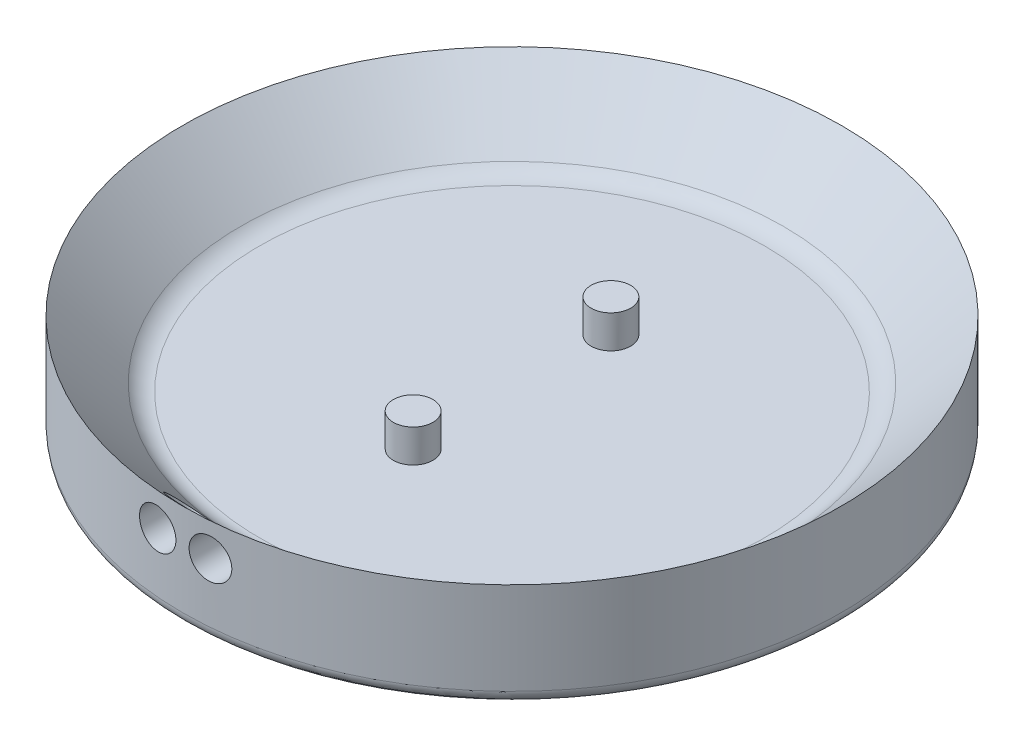
ISO-10303-21;
HEADER;
FILE_DESCRIPTION(('STEP AP214'),'2;1');
FILE_NAME('part.step','',(''),(''),'','','');
FILE_SCHEMA(('AUTOMOTIVE_DESIGN { 1 0 10303 214 1 1 1 1 }'));
ENDSEC;
DATA;
#1=APPLICATION_CONTEXT('core data for automotive mechanical design processes');
#2=APPLICATION_PROTOCOL_DEFINITION('international standard','automotive_design',2000,#1);
#3=PRODUCT_CONTEXT('',#1,'mechanical');
#4=PRODUCT('Part','Part','',(#3));
#5=PRODUCT_RELATED_PRODUCT_CATEGORY('part','',(#4));
#6=PRODUCT_DEFINITION_FORMATION('','',#4);
#7=PRODUCT_DEFINITION_CONTEXT('part definition',#1,'design');
#8=PRODUCT_DEFINITION('design','',#6,#7);
#9=PRODUCT_DEFINITION_SHAPE('','',#8);
#10=(LENGTH_UNIT() NAMED_UNIT(*) SI_UNIT(.MILLI.,.METRE.));
#11=(NAMED_UNIT(*) PLANE_ANGLE_UNIT() SI_UNIT($,.RADIAN.));
#12=(NAMED_UNIT(*) SI_UNIT($,.STERADIAN.) SOLID_ANGLE_UNIT());
#13=UNCERTAINTY_MEASURE_WITH_UNIT(LENGTH_MEASURE(1.E-05),#10,'distance_accuracy_value','');
#14=(GEOMETRIC_REPRESENTATION_CONTEXT(3) GLOBAL_UNCERTAINTY_ASSIGNED_CONTEXT((#13)) GLOBAL_UNIT_ASSIGNED_CONTEXT((#10,
#11,#12)) REPRESENTATION_CONTEXT('',''));
#15=CARTESIAN_POINT('',(0.,0.,0.));
#16=DIRECTION('',(0.,0.,1.));
#17=DIRECTION('',(1.,0.,0.));
#18=AXIS2_PLACEMENT_3D('',#15,#16,#17);
#19=CARTESIAN_POINT('',(0.,1.,0.));
#20=DIRECTION('',(0.,-1.,0.));
#21=DIRECTION('',(0.,0.,-1.));
#22=AXIS2_PLACEMENT_3D('',#19,#20,#21);
#23=TOROIDAL_SURFACE('',#22,24.,1.);
#24=CARTESIAN_POINT('',(0.,0.,0.));
#25=DIRECTION('',(0.,-1.,0.));
#26=DIRECTION('',(0.,0.,-1.));
#27=AXIS2_PLACEMENT_3D('',#24,#25,#26);
#28=CIRCLE('',#27,24.);
#29=CARTESIAN_POINT('',(0.,0.,-24.));
#30=VERTEX_POINT('',#29);
#31=EDGE_CURVE('E55',#30,#30,#28,.T.);
#32=ORIENTED_EDGE('',*,*,#31,.F.);
#33=EDGE_LOOP('',(#32));
#34=FACE_BOUND('',#33,.T.);
#35=CARTESIAN_POINT('',(0.,1.,0.));
#36=DIRECTION('',(0.,-1.,0.));
#37=DIRECTION('',(0.,0.,-1.));
#38=AXIS2_PLACEMENT_3D('',#35,#36,#37);
#39=CIRCLE('',#38,25.);
#40=CARTESIAN_POINT('',(0.,1.,-25.));
#41=VERTEX_POINT('',#40);
#42=EDGE_CURVE('E74',#41,#41,#39,.T.);
#43=ORIENTED_EDGE('',*,*,#42,.T.);
#44=EDGE_LOOP('',(#43));
#45=FACE_BOUND('',#44,.T.);
#46=ADVANCED_FACE('F43',(#34,#45),#23,.T.);
#47=CARTESIAN_POINT('',(-23.,0.,0.));
#48=DIRECTION('',(0.,1.,0.));
#49=DIRECTION('',(0.,0.,1.));
#50=AXIS2_PLACEMENT_3D('',#47,#48,#49);
#51=PLANE('',#50);
#52=ORIENTED_EDGE('',*,*,#31,.T.);
#53=EDGE_LOOP('',(#52));
#54=FACE_BOUND('',#53,.T.);
#55=ADVANCED_FACE('F139',(#54),#51,.F.);
#56=CARTESIAN_POINT('',(-19.1715728752538,3.,0.));
#57=DIRECTION('',(0.,-1.,0.));
#58=DIRECTION('',(0.,0.,-1.));
#59=AXIS2_PLACEMENT_3D('',#56,#57,#58);
#60=PLANE('',#59);
#61=CARTESIAN_POINT('',(0.,3.,7.5));
#62=DIRECTION('',(0.,-1.,0.));
#63=DIRECTION('',(0.,0.,-1.));
#64=AXIS2_PLACEMENT_3D('',#61,#62,#63);
#65=CIRCLE('',#64,1.5);
#66=CARTESIAN_POINT('',(0.,3.,6.));
#67=VERTEX_POINT('',#66);
#68=EDGE_CURVE('E10',#67,#67,#65,.F.);
#69=ORIENTED_EDGE('',*,*,#68,.F.);
#70=EDGE_LOOP('',(#69));
#71=FACE_BOUND('',#70,.T.);
#72=CARTESIAN_POINT('',(0.,3.,-7.5));
#73=DIRECTION('',(0.,-1.,0.));
#74=DIRECTION('',(0.,0.,-1.));
#75=AXIS2_PLACEMENT_3D('',#72,#73,#74);
#76=CIRCLE('',#75,1.5);
#77=CARTESIAN_POINT('',(0.,3.,-9.));
#78=VERTEX_POINT('',#77);
#79=EDGE_CURVE('E50',#78,#78,#76,.F.);
#80=ORIENTED_EDGE('',*,*,#79,.F.);
#81=EDGE_LOOP('',(#80));
#82=FACE_BOUND('',#81,.T.);
#83=CARTESIAN_POINT('',(0.,3.,0.));
#84=DIRECTION('',(0.,-1.,0.));
#85=DIRECTION('',(0.,0.,-1.));
#86=AXIS2_PLACEMENT_3D('',#83,#84,#85);
#87=CIRCLE('',#86,19.1715728752538);
#88=CARTESIAN_POINT('',(0.,3.,-19.1715728752538));
#89=VERTEX_POINT('',#88);
#90=EDGE_CURVE('E60',#89,#89,#87,.T.);
#91=ORIENTED_EDGE('',*,*,#90,.F.);
#92=EDGE_LOOP('',(#91));
#93=FACE_BOUND('',#92,.T.);
#94=ADVANCED_FACE('F144',(#71,#82,#93),#60,.F.);
#95=CARTESIAN_POINT('',(0.,5.,0.));
#96=DIRECTION('',(0.,-1.,0.));
#97=DIRECTION('',(0.,0.,-1.));
#98=AXIS2_PLACEMENT_3D('',#95,#96,#97);
#99=TOROIDAL_SURFACE('',#98,19.1715728752538,2.);
#100=CARTESIAN_POINT('',(0.,3.5857864376269,0.));
#101=DIRECTION('',(0.,-1.,0.));
#102=DIRECTION('',(0.,0.,-1.));
#103=AXIS2_PLACEMENT_3D('',#100,#101,#102);
#104=CIRCLE('',#103,20.5857864376269);
#105=CARTESIAN_POINT('',(0.,3.5857864376269,-20.5857864376269));
#106=VERTEX_POINT('',#105);
#107=EDGE_CURVE('E66',#106,#106,#104,.T.);
#108=ORIENTED_EDGE('',*,*,#107,.F.);
#109=EDGE_LOOP('',(#108));
#110=FACE_BOUND('',#109,.T.);
#111=ORIENTED_EDGE('',*,*,#90,.T.);
#112=EDGE_LOOP('',(#111));
#113=FACE_BOUND('',#112,.T.);
#114=ADVANCED_FACE('F160',(#110,#113),#99,.F.);
#115=CARTESIAN_POINT('',(0.,3.5857864376269,0.));
#116=DIRECTION('',(0.,1.,0.));
#117=DIRECTION('',(0.,0.,1.));
#118=AXIS2_PLACEMENT_3D('',#115,#116,#117);
#119=CONICAL_SURFACE('',#118,20.5857864376269,0.785398163397449);
#120=CARTESIAN_POINT('',(-2.65139076383462,4.14881899676564,20.9819606468927));
#121=CARTESIAN_POINT('',(-2.72542497420691,4.18451854351562,21.0085885687962));
#122=CARTESIAN_POINT('',(-2.795010754431,4.2256118638844,21.0408635599312));
#123=CARTESIAN_POINT('',(-2.92387568672394,4.3156425319557,21.1142389047565));
#124=CARTESIAN_POINT('',(-2.98310284785251,4.36461720527135,21.1553815866178));
#125=CARTESIAN_POINT('',(-3.1041036642441,4.4804133348628,21.2550262957546));
#126=CARTESIAN_POINT('',(-3.1630059834274,4.54868127865626,21.3153179274971));
#127=CARTESIAN_POINT('',(-3.26546682185978,4.68992158945896,21.4427399721577));
#128=CARTESIAN_POINT('',(-3.30901650710475,4.76289663649251,21.5098742938587));
#129=CARTESIAN_POINT('',(-3.39547583001479,4.93839966650395,21.674071738518));
#130=CARTESIAN_POINT('',(-3.43237734284057,5.04201237972336,21.7731309931857));
#131=CARTESIAN_POINT('',(-3.48294193308828,5.25023515358621,21.975943863211));
#132=CARTESIAN_POINT('',(-3.49657553050927,5.35484631083701,22.0797032630514));
#133=CARTESIAN_POINT('',(-3.50235454916626,5.56500544683655,22.2915493643565));
#134=CARTESIAN_POINT('',(-3.49400486352244,5.67052073459008,22.3996808241649));
#135=CARTESIAN_POINT('',(-3.45543316600535,5.87794559084736,22.6155176739394));
#136=CARTESIAN_POINT('',(-3.42521340454889,5.97985552920764,22.7232231065969));
#137=CARTESIAN_POINT('',(-3.34628715193839,6.16857039150218,22.9256982733362));
#138=CARTESIAN_POINT('',(-3.29954883072927,6.25590062777606,23.0207431269384));
#139=CARTESIAN_POINT('',(-3.18651029948879,6.42323904244126,23.2055818109311));
#140=CARTESIAN_POINT('',(-3.12023999429772,6.50325817107691,23.2953834190955));
#141=CARTESIAN_POINT('',(-2.99112846067283,6.62824595043113,23.438230401792));
#142=CARTESIAN_POINT('',(-2.93401534511861,6.67622043335249,23.4938211259571));
#143=CARTESIAN_POINT('',(-2.80940011152838,6.76519362164917,23.5986511649394));
#144=CARTESIAN_POINT('',(-2.7419134015665,6.80620248605226,23.6478997037196));
#145=CARTESIAN_POINT('',(-2.61335744630595,6.87028700028482,23.7268725603604));
#146=CARTESIAN_POINT('',(-2.55442748969971,6.895316081192,23.7584763127986));
#147=CARTESIAN_POINT('',(-2.43085779369609,6.93827050660399,23.8146141538313));
#148=CARTESIAN_POINT('',(-2.36622551496041,6.95620496964712,23.8391573060959));
#149=CARTESIAN_POINT('',(-2.24291591685094,6.98132104172112,23.8762734097205));
#150=CARTESIAN_POINT('',(-2.18487674034516,6.98974154026574,23.8901146703932));
#151=CARTESIAN_POINT('',(-2.0669541170097,6.999669978482,23.9105710180682));
#152=CARTESIAN_POINT('',(-2.00707179066792,7.00118203752355,23.9171904095394));
#153=CARTESIAN_POINT('',(-1.88706376580968,6.99694950309519,23.9227128060676));
#154=CARTESIAN_POINT('',(-1.82693782277221,6.99118859915452,23.921598442035));
#155=CARTESIAN_POINT('',(-1.70843222173764,6.97261284600017,23.9117310231657));
#156=CARTESIAN_POINT('',(-1.65005303318683,6.95979611814768,23.9029759335945));
#157=CARTESIAN_POINT('',(-1.53819754349364,6.92829413652778,23.8788642201954));
#158=CARTESIAN_POINT('',(-1.48462995883017,6.90978233520877,23.8636983184244));
#159=CARTESIAN_POINT('',(-1.38154994573573,6.86770789809791,23.8277431124235));
#160=CARTESIAN_POINT('',(-1.33203925933376,6.84414310810278,23.8069514087941));
#161=CARTESIAN_POINT('',(-1.21564550255684,6.78100418547552,23.7500082939016));
#162=CARTESIAN_POINT('',(-1.15133732692582,6.73907025796645,23.7112030848918));
#163=CARTESIAN_POINT('',(-1.0326889338324,6.64886598246533,23.6263774453465));
#164=CARTESIAN_POINT('',(-0.978372125377375,6.60058119724882,23.5803405273918));
#165=CARTESIAN_POINT('',(-0.859168123829121,6.47898572433059,23.4633568383397));
#166=CARTESIAN_POINT('',(-0.798983366404516,6.40349081681298,23.3899003630913));
#167=CARTESIAN_POINT('',(-0.695979624822928,6.24720286558757,23.2368334557322));
#168=CARTESIAN_POINT('',(-0.653187998282636,6.16640170574997,23.15721356153));
#169=CARTESIAN_POINT('',(-0.5723493623997,5.97517023225837,22.9680815972252));
#170=CARTESIAN_POINT('',(-0.54026180118186,5.86357356439974,22.8571961639108));
#171=CARTESIAN_POINT('',(-0.502044554629696,5.63847057957151,22.6329084623078));
#172=CARTESIAN_POINT('',(-0.495942424461634,5.52496236352188,22.5195036504349));
#173=CARTESIAN_POINT('',(-0.509301812300093,5.29772584660527,22.2919107731094));
#174=CARTESIAN_POINT('',(-0.52904359312356,5.18400871129824,22.1777277027191));
#175=CARTESIAN_POINT('',(-0.595377998185321,4.96097733193852,21.9529358869296));
#176=CARTESIAN_POINT('',(-0.641932135929493,4.85165701680285,21.842322257774));
#177=CARTESIAN_POINT('',(-0.746143237393624,4.67217592305761,21.6593749944488));
#178=CARTESIAN_POINT('',(-0.796750384091204,4.59979890061895,21.5851853035795));
#179=CARTESIAN_POINT('',(-0.913403375668737,4.46200496702152,21.4426466942976));
#180=CARTESIAN_POINT('',(-0.979426127610195,4.39657785596412,21.3742892461607));
#181=CARTESIAN_POINT('',(-1.10947183507139,4.29079795033036,21.2619503195847));
#182=CARTESIAN_POINT('',(-1.17005484585948,4.24822164833409,21.2160899911693));
#183=CARTESIAN_POINT('',(-1.30037663062701,4.17099936504538,21.1311328191529));
#184=CARTESIAN_POINT('',(-1.37010329507893,4.13634305843538,21.0920271858778));
#185=CARTESIAN_POINT('',(-1.50348233147243,4.08311178354928,21.0295242503765));
#186=CARTESIAN_POINT('',(-1.56566395864126,4.06271829105543,21.004550732782));
#187=CARTESIAN_POINT('',(-1.69445410498186,4.02995050430874,20.9616785062909));
#188=CARTESIAN_POINT('',(-1.76105964777954,4.01757087745955,20.9437750958947));
#189=CARTESIAN_POINT('',(-1.8974931014685,4.00192347481265,20.9161448453975));
#190=CARTESIAN_POINT('',(-1.96733915538864,3.99871549521256,20.9064719512541));
#191=CARTESIAN_POINT('',(-2.10748397630747,4.00221773316829,20.8963294919699));
#192=CARTESIAN_POINT('',(-2.17778271049296,4.00892723972147,20.8958592671074));
#193=CARTESIAN_POINT('',(-2.30854133462527,4.03074420729508,20.9037450795463));
#194=CARTESIAN_POINT('',(-2.36923384461343,4.04484839958804,20.9111374120204));
#195=CARTESIAN_POINT('',(-2.4871819564979,4.07999038563828,20.9328259311467));
#196=CARTESIAN_POINT('',(-2.54444350301035,4.10101575122155,20.9471097641613));
#197=CARTESIAN_POINT('',(-2.61694967428602,4.13261366386245,20.9699599100324));
#198=CARTESIAN_POINT('',(-2.63428890479631,4.14057242247007,20.9758096125994));
#199=CARTESIAN_POINT('',(-2.65139076383462,4.14881899676564,20.9819606468927));
#200=B_SPLINE_CURVE_WITH_KNOTS('',3,(#120,#121,#122,#123,#124,#125,#126,#127,#128,#129,#130,
#131,#132,#133,#134,#135,#136,#137,#138,#139,#140,#141,#142,#143,#144,#145,#146,#147,#148,#149,
#150,#151,#152,#153,#154,#155,#156,#157,#158,#159,#160,#161,#162,#163,#164,#165,#166,#167,#168,
#169,#170,#171,#172,#173,#174,#175,#176,#177,#178,#179,#180,#181,#182,#183,#184,#185,#186,#187,
#188,#189,#190,#191,#192,#193,#194,#195,#196,#197,#198,#199),.UNSPECIFIED.,.T.,.F.,(4,2,2,2,2,2,
2,2,2,2,2,2,2,2,2,2,2,2,2,2,2,2,2,2,2,2,2,2,2,2,2,2,2,2,2,2,2,2,2,4),(0.,0.25913619387103,
0.519537855761893,0.84314591310417,1.16693987383334,1.60864476439594,2.05090887223562,
2.50321837739902,2.95548134681997,3.36591788815848,3.77572925814245,4.05398816109445,
4.33183768542707,4.5452737315448,4.75843455525121,4.93842907275552,5.11831624896355,
5.29860756078031,5.47894689904856,5.65426178517794,5.82965156113246,6.08627606615025,
6.34349437047106,6.70545446166836,7.06798169622301,7.5471851638416,8.02689665644518,
8.5118536946582,8.99611635363359,9.34102868397663,9.68542760546999,9.945825511965,
10.2058819753943,10.4151797364727,10.6243380828258,10.8348569988605,11.0453608231423,
11.2327452874661,11.4197950892462,11.4796553975688),.UNSPECIFIED.);
#201=CARTESIAN_POINT('',(-2.65139076383462,4.14881899676564,20.9819606468927));
#202=VERTEX_POINT('',#201);
#203=EDGE_CURVE('E78',#202,#202,#200,.T.);
#204=ORIENTED_EDGE('',*,*,#203,.F.);
#205=EDGE_LOOP('',(#204));
#206=FACE_BOUND('',#205,.T.);
#207=CARTESIAN_POINT('',(1.83083952474417,4.00956894369071,20.9296443790698));
#208=CARTESIAN_POINT('',(1.75478447166187,4.01821151560841,20.9449717336368));
#209=CARTESIAN_POINT('',(1.68030471265768,4.03260319935538,20.9655023358055));
#210=CARTESIAN_POINT('',(1.53693329160857,4.07131599890465,21.0153193801841));
#211=CARTESIAN_POINT('',(1.46806514558209,4.09567655765545,21.0446404782971));
#212=CARTESIAN_POINT('',(1.33805242111261,4.15211607863738,21.1098573517964));
#213=CARTESIAN_POINT('',(1.27683396739197,4.18411082569127,21.1456804356152));
#214=CARTESIAN_POINT('',(1.16178857941135,4.25422946870829,21.2225369807901));
#215=CARTESIAN_POINT('',(1.10795755952691,4.29234995129685,21.2635675377838));
#216=CARTESIAN_POINT('',(0.980502601856421,4.39524247540064,21.3729156857272));
#217=CARTESIAN_POINT('',(0.911886102572185,4.46329099818877,21.4440044355915));
#218=CARTESIAN_POINT('',(0.791211701490972,4.60687988021262,21.5924809845191));
#219=CARTESIAN_POINT('',(0.739197039749021,4.68243914166078,21.6698845837271));
#220=CARTESIAN_POINT('',(0.637426958371377,4.86200692174613,21.8527981568405));
#221=CARTESIAN_POINT('',(0.593145596872006,4.96769130215599,21.9597101630197));
#222=CARTESIAN_POINT('',(0.529562278064357,5.18307960851339,22.1767837957356));
#223=CARTESIAN_POINT('',(0.510280666107908,5.29278673369962,22.2869479945092));
#224=CARTESIAN_POINT('',(0.495904147305461,5.5146705937769,22.5092105927747));
#225=CARTESIAN_POINT('',(0.501124502316265,5.62686092961655,22.6213156093865));
#226=CARTESIAN_POINT('',(0.53693680008075,5.84949939793727,22.8431955777946));
#227=CARTESIAN_POINT('',(0.567506857963238,5.9599489494872,22.9529724557072));
#228=CARTESIAN_POINT('',(0.644677062566,6.14862670892604,23.1396678620751));
#229=CARTESIAN_POINT('',(0.685325366104145,6.22798230441046,23.2179161185892));
#230=CARTESIAN_POINT('',(0.783158814774619,6.38180889582629,23.368736368504));
#231=CARTESIAN_POINT('',(0.840317461235424,6.45628748609085,23.4413172226647));
#232=CARTESIAN_POINT('',(0.953959868691422,6.57731433876918,23.5580509569139));
#233=CARTESIAN_POINT('',(1.00606638236709,6.62580624718613,23.6044398312792));
#234=CARTESIAN_POINT('',(1.12003739245321,6.71695131248337,23.6905533085665));
#235=CARTESIAN_POINT('',(1.18188737480821,6.75961298042755,23.7302876454131));
#236=CARTESIAN_POINT('',(1.3008171863864,6.82845412288274,23.7929751715542));
#237=CARTESIAN_POINT('',(1.35604496764476,6.85620361788638,23.8176992998926));
#238=CARTESIAN_POINT('',(1.47183370578265,6.90534153101549,23.8600554420406));
#239=CARTESIAN_POINT('',(1.53239082272879,6.92673448134817,23.8776925120892));
#240=CARTESIAN_POINT('',(1.65802870704445,6.96196412245185,23.9046125521321));
#241=CARTESIAN_POINT('',(1.72314106750469,6.97574058847549,23.9138293041948));
#242=CARTESIAN_POINT('',(1.85525566995216,6.99448679334146,23.9227444849299));
#243=CARTESIAN_POINT('',(1.92225678914359,6.99946165674271,23.9224484541573));
#244=CARTESIAN_POINT('',(2.04735872965701,7.00039513197041,23.9129826406482));
#245=CARTESIAN_POINT('',(2.10554226597398,6.99738579080729,23.904906871214));
#246=CARTESIAN_POINT('',(2.2198428108531,6.98491609740686,23.8820404934138));
#247=CARTESIAN_POINT('',(2.27595941042068,6.97545447557759,23.8672485637247));
#248=CARTESIAN_POINT('',(2.3871617370613,6.95034039423591,23.8311488987541));
#249=CARTESIAN_POINT('',(2.44211631062564,6.93445530986273,23.8096040708175));
#250=CARTESIAN_POINT('',(2.54782890893045,6.89750663688853,23.7613642858174));
#251=CARTESIAN_POINT('',(2.59858480462746,6.87644044232789,23.7346667385332));
#252=CARTESIAN_POINT('',(2.72439818015181,6.81627821506377,23.6600818996944));
#253=CARTESIAN_POINT('',(2.79601269091068,6.77389946988585,23.6090188748354));
#254=CARTESIAN_POINT('',(2.9278905967207,6.68133119072393,23.499747276734));
#255=CARTESIAN_POINT('',(2.98812124754414,6.63111986133827,23.4415188631288));
#256=CARTESIAN_POINT('',(3.12100278209786,6.50257250008621,23.2945942518659));
#257=CARTESIAN_POINT('',(3.18811256588472,6.42133063640609,23.2034376441819));
#258=CARTESIAN_POINT('',(3.30223357382283,6.25144433727767,23.0158584420833));
#259=CARTESIAN_POINT('',(3.34923154622554,6.16279506689252,22.9194324226675));
#260=CARTESIAN_POINT('',(3.42551869737541,5.97771793709672,22.7210068993069));
#261=CARTESIAN_POINT('',(3.45421592693989,5.88113437663324,22.6189272408515));
#262=CARTESIAN_POINT('',(3.49197113163186,5.68453498779798,22.4141795816378));
#263=CARTESIAN_POINT('',(3.50100573510056,5.58451521824959,22.3115110260031));
#264=CARTESIAN_POINT('',(3.49925810569949,5.42351074021961,22.1487943911915));
#265=CARTESIAN_POINT('',(3.49497600068819,5.36297708506791,22.0881848036241));
#266=CARTESIAN_POINT('',(3.47887947111869,5.24182216017343,21.9680685045676));
#267=CARTESIAN_POINT('',(3.46706235009211,5.18120086682022,21.908562195744));
#268=CARTESIAN_POINT('',(3.41975579986905,5.00017806622695,21.7327738093703));
#269=CARTESIAN_POINT('',(3.37241214866979,4.88015589768537,21.6187546051965));
#270=CARTESIAN_POINT('',(3.26995875417529,4.69816528427016,21.4503707656018));
#271=CARTESIAN_POINT('',(3.22696789896862,4.63344973276324,21.3914571370886));
#272=CARTESIAN_POINT('',(3.12833886212686,4.50845174607923,21.2797713323301));
#273=CARTESIAN_POINT('',(3.07272087411341,4.44816243389432,21.226989551439));
#274=CARTESIAN_POINT('',(2.96086098893554,4.34620016078028,21.1399019204203));
#275=CARTESIAN_POINT('',(2.90703617434735,4.30323215589472,21.1040203458825));
#276=CARTESIAN_POINT('',(2.7910532590327,4.22361351828358,21.0393584915353));
#277=CARTESIAN_POINT('',(2.72890542981381,4.18695522412708,21.0105695810158));
#278=CARTESIAN_POINT('',(2.60775658098806,4.12725379834823,20.9657621645949));
#279=CARTESIAN_POINT('',(2.54985530955087,4.1029693369385,20.9484348081833));
#280=CARTESIAN_POINT('',(2.42989605372543,4.06152589877838,20.9209661290993));
#281=CARTESIAN_POINT('',(2.36783855794505,4.04436608615223,20.9108239633496));
#282=CARTESIAN_POINT('',(2.24101438099137,4.01806720286488,20.898346906456));
#283=CARTESIAN_POINT('',(2.17623782360742,4.00896060919519,20.8960435222022));
#284=CARTESIAN_POINT('',(2.04635056964915,3.99930837723227,20.8994635398115));
#285=CARTESIAN_POINT('',(1.98124074245016,3.9987464961921,20.9051716898741));
#286=CARTESIAN_POINT('',(1.88809426809609,4.00389616678198,20.9188819786031));
#287=CARTESIAN_POINT('',(1.85935616466066,4.00632843433149,20.9238974282316));
#288=CARTESIAN_POINT('',(1.83083952474417,4.00956894369071,20.9296443790698));
#289=B_SPLINE_CURVE_WITH_KNOTS('',3,(#207,#208,#209,#210,#211,#212,#213,#214,#215,#216,#217,
#218,#219,#220,#221,#222,#223,#224,#225,#226,#227,#228,#229,#230,#231,#232,#233,#234,#235,#236,
#237,#238,#239,#240,#241,#242,#243,#244,#245,#246,#247,#248,#249,#250,#251,#252,#253,#254,#255,
#256,#257,#258,#259,#260,#261,#262,#263,#264,#265,#266,#267,#268,#269,#270,#271,#272,#273,#274,
#275,#276,#277,#278,#279,#280,#281,#282,#283,#284,#285,#286,#287,#288),.UNSPECIFIED.,.T.,.F.,(4,
2,2,2,2,2,2,2,2,2,2,2,2,2,2,2,2,2,2,2,2,2,2,2,2,2,2,2,2,2,2,2,2,2,2,2,2,2,2,2,4),(0.,
0.23409119874748,0.469117700575535,0.701662542276101,0.934078252114976,1.29198928483513,
1.65082504291307,2.11853765259369,2.58663065876834,3.06076291252888,3.53448626470731,
3.8892696277443,4.24348670688536,4.4975670767416,4.7512724815219,4.95021535223006,
5.14901603469521,5.34936696880237,5.54960121410753,5.72524999614244,5.90093334993001,
6.08364823939751,6.2664552181797,6.55769498678003,6.84976012863271,7.26550400451914,
7.68152139539506,8.11039116704974,8.53977042996232,8.79675164662714,9.05382487781698,
9.56602553147857,9.85770929452228,10.1489298351078,10.3810518437608,10.6128899838893,
10.8074647852768,11.002016752367,11.1973497762711,11.3923114427685,11.4800833152709),.UNSPECIFIED.);
#290=CARTESIAN_POINT('',(1.83083952474417,4.00956894369071,20.9296443790698));
#291=VERTEX_POINT('',#290);
#292=EDGE_CURVE('E79',#291,#291,#289,.T.);
#293=ORIENTED_EDGE('',*,*,#292,.F.);
#294=EDGE_LOOP('',(#293));
#295=FACE_BOUND('',#294,.T.);
#296=CARTESIAN_POINT('',(0.,8.,0.));
#297=DIRECTION('',(0.,-1.,0.));
#298=DIRECTION('',(0.,0.,-1.));
#299=AXIS2_PLACEMENT_3D('',#296,#297,#298);
#300=CIRCLE('',#299,25.);
#301=CARTESIAN_POINT('',(0.,8.,-25.));
#302=VERTEX_POINT('',#301);
#303=EDGE_CURVE('E70',#302,#302,#300,.T.);
#304=ORIENTED_EDGE('',*,*,#303,.F.);
#305=EDGE_LOOP('',(#304));
#306=FACE_BOUND('',#305,.T.);
#307=ORIENTED_EDGE('',*,*,#107,.T.);
#308=EDGE_LOOP('',(#307));
#309=FACE_BOUND('',#308,.T.);
#310=ADVANCED_FACE('F153',(#206,#295,#306,#309),#119,.F.);
#311=CARTESIAN_POINT('',(0.,0.,0.));
#312=DIRECTION('',(0.,-1.,0.));
#313=DIRECTION('',(0.,0.,-1.));
#314=AXIS2_PLACEMENT_3D('',#311,#312,#313);
#315=CYLINDRICAL_SURFACE('',#314,25.);
#316=CARTESIAN_POINT('',(-0.499999999999999,5.5,24.9949994999));
#317=CARTESIAN_POINT('',(-0.500003683166721,5.58423277342647,24.9949998057339));
#318=CARTESIAN_POINT('',(-0.507118771022967,5.66852458594066,24.9948602377079));
#319=CARTESIAN_POINT('',(-0.535402657769668,5.83478498863144,24.9942700719694));
#320=CARTESIAN_POINT('',(-0.55658783131368,5.91675075574423,24.993819111837));
#321=CARTESIAN_POINT('',(-0.612408055292488,6.07593031804199,24.992513506399));
#322=CARTESIAN_POINT('',(-0.647037025994168,6.15314624300412,24.991659043533));
#323=CARTESIAN_POINT('',(-0.728750178072181,6.30064438894751,24.9894094681957));
#324=CARTESIAN_POINT('',(-0.775831341190145,6.37092828450731,24.9880144867014));
#325=CARTESIAN_POINT('',(-0.881102523219352,6.50258207961182,24.9845236734831));
#326=CARTESIAN_POINT('',(-0.939291155799228,6.56395308989886,24.9824279291974));
#327=CARTESIAN_POINT('',(-1.06511938508295,6.67605197944129,24.9773793001184));
#328=CARTESIAN_POINT('',(-1.13275928062682,6.72677952203333,24.9744263882192));
#329=CARTESIAN_POINT('',(-1.2755263348732,6.81614110571792,24.9675415385676));
#330=CARTESIAN_POINT('',(-1.3506508809319,6.85477934742084,24.9636099417284));
#331=CARTESIAN_POINT('',(-1.50625756031231,6.91890803372045,24.9547040738696));
#332=CARTESIAN_POINT('',(-1.58673968725542,6.94439849397027,24.9497298040913));
#333=CARTESIAN_POINT('',(-1.75084875861645,6.98155621175112,24.9387508639473));
#334=CARTESIAN_POINT('',(-1.83447871422712,6.99320986756243,24.9327451863224));
#335=CARTESIAN_POINT('',(-2.00243841790063,7.00235418253354,24.919818107065));
#336=CARTESIAN_POINT('',(-2.08676817875654,6.99984458220457,24.9128966886572));
#337=CARTESIAN_POINT('',(-2.2540553208921,6.98073244766344,24.8983194322577));
#338=CARTESIAN_POINT('',(-2.33700677312249,6.96407995561331,24.890661076273));
#339=CARTESIAN_POINT('',(-2.49890532769857,6.91710920161685,24.8749289850753));
#340=CARTESIAN_POINT('',(-2.57785229872674,6.88679049184107,24.8668552362578));
#341=CARTESIAN_POINT('',(-2.72986908587162,6.81318449169934,24.8506275425916));
#342=CARTESIAN_POINT('',(-2.80291197145605,6.76984161140123,24.8424734018643));
#343=CARTESIAN_POINT('',(-2.94068047609568,6.67144603589525,24.826542551742));
#344=CARTESIAN_POINT('',(-3.00540600138081,6.61639320868783,24.8187658466028));
#345=CARTESIAN_POINT('',(-3.12471881500871,6.49608596691192,24.8040269984405));
#346=CARTESIAN_POINT('',(-3.17930244533135,6.4308278870401,24.7970651496567));
#347=CARTESIAN_POINT('',(-3.27671633723554,6.29195234843078,24.7843811935656));
#348=CARTESIAN_POINT('',(-3.31954699961696,6.21833517487625,24.7786590439834));
#349=CARTESIAN_POINT('',(-3.3919579353808,6.06530857012059,24.7688504945754));
#350=CARTESIAN_POINT('',(-3.42161869407228,5.98593786985321,24.7647541756062));
#351=CARTESIAN_POINT('',(-3.46718389700708,5.82327136754151,24.7584161477223));
#352=CARTESIAN_POINT('',(-3.48308911500971,5.73997578655259,24.7561743344906));
#353=CARTESIAN_POINT('',(-3.50058413106503,5.57258536237112,24.7537065780757));
#354=CARTESIAN_POINT('',(-3.50229483119493,5.48850338945697,24.7534636098438));
#355=CARTESIAN_POINT('',(-3.49166691161003,5.3212518139341,24.7549649569571));
#356=CARTESIAN_POINT('',(-3.47932863534527,5.23808218907174,24.7567092237211));
#357=CARTESIAN_POINT('',(-3.44103395786608,5.07527206122276,24.7620607691689));
#358=CARTESIAN_POINT('',(-3.41511894609376,4.99562162564234,24.7656623851));
#359=CARTESIAN_POINT('',(-3.35046072367296,4.84180833767044,24.7744923556862));
#360=CARTESIAN_POINT('',(-3.3117171767513,4.76764562919059,24.7797207529837));
#361=CARTESIAN_POINT('',(-3.22228004383939,4.62647196956288,24.791509616028));
#362=CARTESIAN_POINT('',(-3.17152342517117,4.55950154696027,24.7980770818014));
#363=CARTESIAN_POINT('',(-3.05961885427778,4.43500496540603,24.8121322092034));
#364=CARTESIAN_POINT('',(-2.99847038456151,4.3774792770618,24.8196199166527));
#365=CARTESIAN_POINT('',(-2.8669231239589,4.27298724379397,24.8351599053072));
#366=CARTESIAN_POINT('',(-2.79644921358088,4.22611608959016,24.8432164928004));
#367=CARTESIAN_POINT('',(-2.64864041199122,4.14486965139762,24.8594091820179));
#368=CARTESIAN_POINT('',(-2.5713053292502,4.11049471637704,24.8675452859563));
#369=CARTESIAN_POINT('',(-2.41157737143113,4.05508440230088,24.8835439490063));
#370=CARTESIAN_POINT('',(-2.3291635633776,4.03410893143186,24.8914051331133));
#371=CARTESIAN_POINT('',(-2.16192100507173,4.00635800630332,24.9064879889793));
#372=CARTESIAN_POINT('',(-2.07709227168058,3.99958245292353,24.9137096652019));
#373=CARTESIAN_POINT('',(-1.90760182070018,4.00045658786334,24.9272595570853));
#374=CARTESIAN_POINT('',(-1.82294009798151,4.00807835052248,24.933589476848));
#375=CARTESIAN_POINT('',(-1.65604739188914,4.03751037744472,24.9452301367468));
#376=CARTESIAN_POINT('',(-1.57381635265392,4.05932031537226,24.9505409003203));
#377=CARTESIAN_POINT('',(-1.41452058287994,4.11640314235596,24.9600776335551));
#378=CARTESIAN_POINT('',(-1.33743428742574,4.15161506293445,24.96430837296));
#379=CARTESIAN_POINT('',(-1.19024615253074,4.23452283030212,24.971759069289));
#380=CARTESIAN_POINT('',(-1.12014394036466,4.28221801039374,24.9749790801734));
#381=CARTESIAN_POINT('',(-0.989131522454857,4.38858453526176,24.9805106782861));
#382=CARTESIAN_POINT('',(-0.928195162721165,4.44722353694137,24.9828248816469));
#383=CARTESIAN_POINT('',(-0.816999934652494,4.57392456083714,24.9867087771472));
#384=CARTESIAN_POINT('',(-0.766743603372256,4.64198881570646,24.988278292494));
#385=CARTESIAN_POINT('',(-0.678361480328562,4.78558885966738,24.9908340575436));
#386=CARTESIAN_POINT('',(-0.640236249591931,4.86112499409917,24.9918202802727));
#387=CARTESIAN_POINT('',(-0.577238239907185,5.01746883047406,24.9933550810494));
#388=CARTESIAN_POINT('',(-0.552350115710642,5.09827030594853,24.9939041662217));
#389=CARTESIAN_POINT('',(-0.522982230925985,5.23296778911593,24.9945316266226));
#390=CARTESIAN_POINT('',(-0.514374908248798,5.28599940621919,24.9947084805325));
#391=CARTESIAN_POINT('',(-0.502882618158165,5.39267935852846,24.9949423197589));
#392=CARTESIAN_POINT('',(-0.499997653121898,5.44632769399066,24.9949993050256));
#393=CARTESIAN_POINT('',(-0.499999999999999,5.5,24.9949994999));
#394=B_SPLINE_CURVE_WITH_KNOTS('',3,(#316,#317,#318,#319,#320,#321,#322,#323,#324,#325,#326,
#327,#328,#329,#330,#331,#332,#333,#334,#335,#336,#337,#338,#339,#340,#341,#342,#343,#344,#345,
#346,#347,#348,#349,#350,#351,#352,#353,#354,#355,#356,#357,#358,#359,#360,#361,#362,#363,#364,
#365,#366,#367,#368,#369,#370,#371,#372,#373,#374,#375,#376,#377,#378,#379,#380,#381,#382,#383,
#384,#385,#386,#387,#388,#389,#390,#391,#392,#393),.UNSPECIFIED.,.T.,.F.,(4,2,2,2,2,2,2,2,2,2,2,
2,2,2,2,2,2,2,2,2,2,2,2,2,2,2,2,2,2,2,2,2,2,2,2,2,2,2,4),(0.,0.252502703589351,
0.505299783955513,0.757982673980076,1.0106043728196,1.26319456235192,1.51579274035591,
1.76830305158326,2.02081306218325,2.27357108773246,2.52633374414353,2.77999298157795,
3.03366053179779,3.28842655076591,3.54319544171849,3.79805604613025,4.05290795820212,
4.30618020301668,4.55943820015392,4.81053682945057,5.06162932036523,5.31196075811607,
5.56229875830064,5.81398060065088,6.06567497987223,6.3195366715621,6.5734054520233,
6.82840146390669,7.08339569582513,7.33789583764584,7.59239012603527,7.84574024195914,
8.09907682988991,8.35167624054126,8.60433558960296,8.85700662170006,9.10938410038888,
9.27027630652214,9.43116857949311),.UNSPECIFIED.);
#395=CARTESIAN_POINT('',(-0.499999999999999,5.5,24.9949994999));
#396=VERTEX_POINT('',#395);
#397=EDGE_CURVE('E111',#396,#396,#394,.T.);
#398=ORIENTED_EDGE('',*,*,#397,.F.);
#399=EDGE_LOOP('',(#398));
#400=FACE_BOUND('',#399,.T.);
#401=CARTESIAN_POINT('',(3.5,5.5,24.7537875889731));
#402=CARTESIAN_POINT('',(3.49999622409814,5.58371350763935,24.7537885039408));
#403=CARTESIAN_POINT('',(3.49296750364875,5.66748610970001,24.7547850877104));
#404=CARTESIAN_POINT('',(3.4650396720896,5.83270742886029,24.7587093981257));
#405=CARTESIAN_POINT('',(3.44412432481547,5.91415330916788,24.7616393852709));
#406=CARTESIAN_POINT('',(3.38905839402718,6.07229267999128,24.7692359748284));
#407=CARTESIAN_POINT('',(3.3549175005086,6.14898960233122,24.7739013057024));
#408=CARTESIAN_POINT('',(3.27440823331572,6.29553322027974,24.7846705090601));
#409=CARTESIAN_POINT('',(3.22804239240375,6.36538133071641,24.7907740835409));
#410=CARTESIAN_POINT('',(3.12412285274043,6.49669247574658,24.8040844875963));
#411=CARTESIAN_POINT('',(3.06650976304241,6.55810791309225,24.8112971286563));
#412=CARTESIAN_POINT('',(2.94188343379827,6.67042451140584,24.8263822207724));
#413=CARTESIAN_POINT('',(2.87486944697122,6.72132483572729,24.8342547242612));
#414=CARTESIAN_POINT('',(2.73274122197566,6.81157634158446,24.8502972288218));
#415=CARTESIAN_POINT('',(2.6575667622065,6.85083238489344,24.8584690989083));
#416=CARTESIAN_POINT('',(2.50166949898877,6.91614634482965,24.8746414131254));
#417=CARTESIAN_POINT('',(2.42094660518721,6.94220404647176,24.8826418544618));
#418=CARTESIAN_POINT('',(2.25602533839703,6.9804161862021,24.8981369005562));
#419=CARTESIAN_POINT('',(2.17181930343215,6.99253807760426,24.9056302828703));
#420=CARTESIAN_POINT('',(2.0025021110329,7.00239298078054,24.9198154324349));
#421=CARTESIAN_POINT('',(1.91739097105819,7.00012626961275,24.926507215118));
#422=CARTESIAN_POINT('',(1.74898295147114,6.98126496928219,24.9388886253235));
#423=CARTESIAN_POINT('',(1.66568100260621,6.96471779052752,24.9445814940121));
#424=CARTESIAN_POINT('',(1.50299696522009,6.91779910948289,24.9549122903636));
#425=CARTESIAN_POINT('',(1.42361478778938,6.88742792091333,24.9595502419631));
#426=CARTESIAN_POINT('',(1.27139394657954,6.81386768067623,24.9677662087136));
#427=CARTESIAN_POINT('',(1.19852861263051,6.77073430925258,24.9713486959815));
#428=CARTESIAN_POINT('',(1.06105325466232,6.67281735243775,24.9775681069757));
#429=CARTESIAN_POINT('',(0.996443136585337,6.61803389980358,24.9802050414762));
#430=CARTESIAN_POINT('',(0.87745126171593,6.4984903729066,24.9846678169923));
#431=CARTESIAN_POINT('',(0.823049709468772,6.43375005926601,24.9864952373059));
#432=CARTESIAN_POINT('',(0.725871531950355,6.29605135107961,24.989507433928));
#433=CARTESIAN_POINT('',(0.683094903145986,6.22309295903149,24.9906922104317));
#434=CARTESIAN_POINT('',(0.610384733456387,6.07102740728686,24.9925740937024));
#435=CARTESIAN_POINT('',(0.580451473308375,5.99192011322899,24.9932711898096));
#436=CARTESIAN_POINT('',(0.534280493527142,5.82980269696876,24.9943009922043));
#437=CARTESIAN_POINT('',(0.518042799233694,5.7467925675456,24.9946336978177));
#438=CARTESIAN_POINT('',(0.499720815735184,5.57919231676456,24.9950068012446));
#439=CARTESIAN_POINT('',(0.497641871082853,5.49460161086113,24.9950470886784));
#440=CARTESIAN_POINT('',(0.507710648674472,5.32627142557326,24.9948445527496));
#441=CARTESIAN_POINT('',(0.519858389873648,5.24253194732311,24.9946017290097));
#442=CARTESIAN_POINT('',(0.558037293101485,5.07827267541531,24.9937783297185));
#443=CARTESIAN_POINT('',(0.584069869015981,4.99775321054779,24.9931977197701));
#444=CARTESIAN_POINT('',(0.649278630155792,4.84222977536792,24.991588480521));
#445=CARTESIAN_POINT('',(0.688454799546764,4.76722579841109,24.99055985176));
#446=CARTESIAN_POINT('',(0.778825770367765,4.62487734895132,24.9879063885331));
#447=CARTESIAN_POINT('',(0.830018352378815,4.55753146541209,24.9862816641342));
#448=CARTESIAN_POINT('',(0.942963872265764,4.43239594180629,24.9822737886441));
#449=CARTESIAN_POINT('',(1.00471675516437,4.37460625199291,24.9798906415013));
#450=CARTESIAN_POINT('',(1.1369886707002,4.27024167714228,24.9742192782677));
#451=CARTESIAN_POINT('',(1.20750415238282,4.2236622715782,24.9709314281469));
#452=CARTESIAN_POINT('',(1.35530182801099,4.14299890669593,24.9633456319005));
#453=CARTESIAN_POINT('',(1.43258399258981,4.10891489315232,24.9590476901583));
#454=CARTESIAN_POINT('',(1.59173476813293,4.05417726197989,24.9494034582253));
#455=CARTESIAN_POINT('',(1.67360500425231,4.03352843634859,24.9440567948655));
#456=CARTESIAN_POINT('',(1.83957731342221,4.00623364345147,24.9323659918882));
#457=CARTESIAN_POINT('',(1.92367942051616,3.9995878899034,24.9260218370484));
#458=CARTESIAN_POINT('',(2.09196950741072,4.00045291646907,24.9124629286377));
#459=CARTESIAN_POINT('',(2.1761570999819,4.00800219732922,24.9052458571675));
#460=CARTESIAN_POINT('',(2.34202382111794,4.03708857681478,24.8901961146103));
#461=CARTESIAN_POINT('',(2.4237028693181,4.05862612308517,24.8823634238296));
#462=CARTESIAN_POINT('',(2.58263461195675,4.11519535837435,24.8663710846736));
#463=CARTESIAN_POINT('',(2.6598655475666,4.15028781450012,24.858210114363));
#464=CARTESIAN_POINT('',(2.80732958645895,4.23297023439132,24.8419888527387));
#465=CARTESIAN_POINT('',(2.87756279381322,4.28056001225555,24.8339285599293));
#466=CARTESIAN_POINT('',(3.0091912733211,4.3870251187566,24.8183234192581));
#467=CARTESIAN_POINT('',(3.07056801257881,4.44592352855406,24.8107796691433));
#468=CARTESIAN_POINT('',(3.18256283792351,4.57331869469399,24.7966628629128));
#469=CARTESIAN_POINT('',(3.23317852021792,4.64181758992385,24.7900900237779));
#470=CARTESIAN_POINT('',(3.32198333726809,4.78619387381419,24.7783460318352));
#471=CARTESIAN_POINT('',(3.36021797075554,4.86204288462116,24.7731697588087));
#472=CARTESIAN_POINT('',(3.42334282790546,5.01912320790786,24.7645260185682));
#473=CARTESIAN_POINT('',(3.44824957838278,5.10034771350585,24.7610564354614));
#474=CARTESIAN_POINT('',(3.47738214545194,5.23508034674476,24.7569774626534));
#475=CARTESIAN_POINT('',(3.4858524103386,5.28769125285851,24.7557844965459));
#476=CARTESIAN_POINT('',(3.49716251984473,5.39352680551855,24.7541892713292));
#477=CARTESIAN_POINT('',(3.50000240177855,5.44675144799507,24.7537870069798));
#478=CARTESIAN_POINT('',(3.5,5.5,24.7537875889731));
#479=B_SPLINE_CURVE_WITH_KNOTS('',3,(#401,#402,#403,#404,#405,#406,#407,#408,#409,#410,#411,
#412,#413,#414,#415,#416,#417,#418,#419,#420,#421,#422,#423,#424,#425,#426,#427,#428,#429,#430,
#431,#432,#433,#434,#435,#436,#437,#438,#439,#440,#441,#442,#443,#444,#445,#446,#447,#448,#449,
#450,#451,#452,#453,#454,#455,#456,#457,#458,#459,#460,#461,#462,#463,#464,#465,#466,#467,#468,
#469,#470,#471,#472,#473,#474,#475,#476,#477,#478),.UNSPECIFIED.,.T.,.F.,(4,2,2,2,2,2,2,2,2,2,2,
2,2,2,2,2,2,2,2,2,2,2,2,2,2,2,2,2,2,2,2,2,2,2,2,2,2,2,4),(0.,0.250945154333987,
0.502184230199774,0.753239577168161,1.0042429513521,1.25660946111401,1.50899604296621,
1.76339125289018,2.01779060647276,2.27278290314075,2.52777028984875,2.7819143741346,
3.03605269119274,3.28909817716544,3.54214077974503,3.79468751844517,4.04723418038986,
4.29978636235329,4.5523390115921,4.80498698748123,5.05763529999162,5.3103093444676,
5.56298308454332,5.81561019271131,6.0682359857338,6.32075973653176,6.57328239145604,
6.82589506563083,7.07851159520391,7.33181427714961,7.58512506555177,7.83958488724955,
8.09404092399982,8.34902194049777,8.60405985465771,8.85814961161063,9.11192355824205,
9.27154600193128,9.4311673877476),.UNSPECIFIED.);
#480=CARTESIAN_POINT('',(3.5,5.5,24.7537875889731));
#481=VERTEX_POINT('',#480);
#482=EDGE_CURVE('E88',#481,#481,#479,.T.);
#483=ORIENTED_EDGE('',*,*,#482,.F.);
#484=EDGE_LOOP('',(#483));
#485=FACE_BOUND('',#484,.T.);
#486=ORIENTED_EDGE('',*,*,#42,.F.);
#487=EDGE_LOOP('',(#486));
#488=FACE_BOUND('',#487,.T.);
#489=ORIENTED_EDGE('',*,*,#303,.T.);
#490=EDGE_LOOP('',(#489));
#491=FACE_BOUND('',#490,.T.);
#492=ADVANCED_FACE('F150',(#400,#485,#488,#491),#315,.T.);
#493=CARTESIAN_POINT('',(2.,5.5,-25.001));
#494=DIRECTION('',(0.,0.,1.));
#495=DIRECTION('',(1.,0.,0.));
#496=AXIS2_PLACEMENT_3D('',#493,#494,#495);
#497=CYLINDRICAL_SURFACE('',#496,1.5);
#498=ORIENTED_EDGE('',*,*,#482,.T.);
#499=EDGE_LOOP('',(#498));
#500=FACE_BOUND('',#499,.T.);
#501=ORIENTED_EDGE('',*,*,#292,.T.);
#502=EDGE_LOOP('',(#501));
#503=FACE_BOUND('',#502,.T.);
#504=ADVANCED_FACE('F95',(#500,#503),#497,.F.);
#505=CARTESIAN_POINT('',(-2.,5.5,-25.001));
#506=DIRECTION('',(0.,0.,1.));
#507=DIRECTION('',(1.,0.,0.));
#508=AXIS2_PLACEMENT_3D('',#505,#506,#507);
#509=CYLINDRICAL_SURFACE('',#508,1.5);
#510=ORIENTED_EDGE('',*,*,#397,.T.);
#511=EDGE_LOOP('',(#510));
#512=FACE_BOUND('',#511,.T.);
#513=ORIENTED_EDGE('',*,*,#203,.T.);
#514=EDGE_LOOP('',(#513));
#515=FACE_BOUND('',#514,.T.);
#516=ADVANCED_FACE('F101',(#512,#515),#509,.F.);
#517=CARTESIAN_POINT('',(0.,5.5,-7.5));
#518=DIRECTION('',(0.,-1.,0.));
#519=DIRECTION('',(0.,0.,-1.));
#520=AXIS2_PLACEMENT_3D('',#517,#518,#519);
#521=CYLINDRICAL_SURFACE('',#520,1.5);
#522=CARTESIAN_POINT('',(0.,5.5,-7.5));
#523=DIRECTION('',(0.,1.,0.));
#524=DIRECTION('',(0.,0.,1.));
#525=AXIS2_PLACEMENT_3D('',#522,#523,#524);
#526=CIRCLE('',#525,1.5);
#527=CARTESIAN_POINT('',(0.,5.5,-6.));
#528=VERTEX_POINT('',#527);
#529=EDGE_CURVE('E89',#528,#528,#526,.T.);
#530=ORIENTED_EDGE('',*,*,#529,.F.);
#531=EDGE_LOOP('',(#530));
#532=FACE_BOUND('',#531,.T.);
#533=ORIENTED_EDGE('',*,*,#79,.T.);
#534=EDGE_LOOP('',(#533));
#535=FACE_BOUND('',#534,.T.);
#536=ADVANCED_FACE('F120',(#532,#535),#521,.T.);
#537=CARTESIAN_POINT('',(0.,5.5,-7.5));
#538=DIRECTION('',(0.,1.,0.));
#539=DIRECTION('',(0.,0.,1.));
#540=AXIS2_PLACEMENT_3D('',#537,#538,#539);
#541=PLANE('',#540);
#542=ORIENTED_EDGE('',*,*,#529,.T.);
#543=EDGE_LOOP('',(#542));
#544=FACE_BOUND('',#543,.T.);
#545=ADVANCED_FACE('F123',(#544),#541,.T.);
#546=CARTESIAN_POINT('',(0.,5.5,7.5));
#547=DIRECTION('',(0.,-1.,0.));
#548=DIRECTION('',(0.,0.,-1.));
#549=AXIS2_PLACEMENT_3D('',#546,#547,#548);
#550=CYLINDRICAL_SURFACE('',#549,1.5);
#551=CARTESIAN_POINT('',(0.,5.5,7.5));
#552=DIRECTION('',(0.,1.,0.));
#553=DIRECTION('',(0.,0.,1.));
#554=AXIS2_PLACEMENT_3D('',#551,#552,#553);
#555=CIRCLE('',#554,1.5);
#556=CARTESIAN_POINT('',(0.,5.5,9.));
#557=VERTEX_POINT('',#556);
#558=EDGE_CURVE('E260',#557,#557,#555,.T.);
#559=ORIENTED_EDGE('',*,*,#558,.F.);
#560=EDGE_LOOP('',(#559));
#561=FACE_BOUND('',#560,.T.);
#562=ORIENTED_EDGE('',*,*,#68,.T.);
#563=EDGE_LOOP('',(#562));
#564=FACE_BOUND('',#563,.T.);
#565=ADVANCED_FACE('F127',(#561,#564),#550,.T.);
#566=CARTESIAN_POINT('',(0.,5.5,7.5));
#567=DIRECTION('',(0.,1.,0.));
#568=DIRECTION('',(0.,0.,1.));
#569=AXIS2_PLACEMENT_3D('',#566,#567,#568);
#570=PLANE('',#569);
#571=ORIENTED_EDGE('',*,*,#558,.T.);
#572=EDGE_LOOP('',(#571));
#573=FACE_BOUND('',#572,.T.);
#574=ADVANCED_FACE('F129',(#573),#570,.T.);
#575=CLOSED_SHELL('',(#46,#55,#94,#114,#310,#492,#504,#516,#536,#545,#565,#574));
#576=MANIFOLD_SOLID_BREP('B2',#575);
#577=ADVANCED_BREP_SHAPE_REPRESENTATION('',(#18,#576),#14);
#578=SHAPE_DEFINITION_REPRESENTATION(#9,#577);
ENDSEC;
END-ISO-10303-21;
